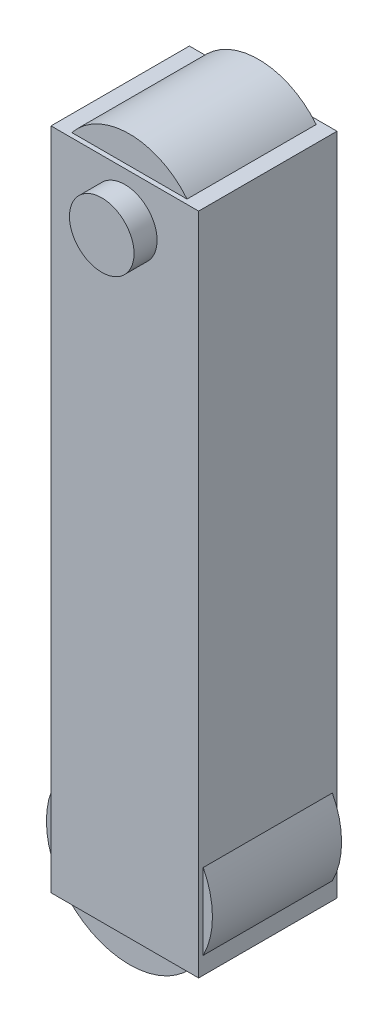
ISO-10303-21;
HEADER;
FILE_DESCRIPTION(('STEP AP214'),'2;1');
FILE_NAME('part.step','',(''),(''),'','','');
FILE_SCHEMA(('AUTOMOTIVE_DESIGN { 1 0 10303 214 1 1 1 1 }'));
ENDSEC;
DATA;
#1=APPLICATION_CONTEXT('core data for automotive mechanical design processes');
#2=APPLICATION_PROTOCOL_DEFINITION('international standard','automotive_design',2000,#1);
#3=PRODUCT_CONTEXT('',#1,'mechanical');
#4=PRODUCT('Part','Part','',(#3));
#5=PRODUCT_RELATED_PRODUCT_CATEGORY('part','',(#4));
#6=PRODUCT_DEFINITION_FORMATION('','',#4);
#7=PRODUCT_DEFINITION_CONTEXT('part definition',#1,'design');
#8=PRODUCT_DEFINITION('design','',#6,#7);
#9=PRODUCT_DEFINITION_SHAPE('','',#8);
#10=(LENGTH_UNIT() NAMED_UNIT(*) SI_UNIT(.MILLI.,.METRE.));
#11=(NAMED_UNIT(*) PLANE_ANGLE_UNIT() SI_UNIT($,.RADIAN.));
#12=(NAMED_UNIT(*) SI_UNIT($,.STERADIAN.) SOLID_ANGLE_UNIT());
#13=UNCERTAINTY_MEASURE_WITH_UNIT(LENGTH_MEASURE(1.E-05),#10,'distance_accuracy_value','');
#14=(GEOMETRIC_REPRESENTATION_CONTEXT(3) GLOBAL_UNCERTAINTY_ASSIGNED_CONTEXT((#13)) GLOBAL_UNIT_ASSIGNED_CONTEXT((#10,
#11,#12)) REPRESENTATION_CONTEXT('',''));
#15=CARTESIAN_POINT('',(0.,0.,0.));
#16=DIRECTION('',(0.,0.,1.));
#17=DIRECTION('',(1.,0.,0.));
#18=AXIS2_PLACEMENT_3D('',#15,#16,#17);
#19=CARTESIAN_POINT('',(-16.,64.,15.));
#20=DIRECTION('',(1.,0.,0.));
#21=DIRECTION('',(0.,0.,-1.));
#22=AXIS2_PLACEMENT_3D('',#19,#20,#21);
#23=PLANE('',#22);
#24=DIRECTION('',(0.,0.,-1.));
#25=VECTOR('',#24,1.);
#26=CARTESIAN_POINT('',(-16.,84.2462112512353,14.));
#27=LINE('',#26,#25);
#28=CARTESIAN_POINT('',(-16.,84.2462112512353,14.));
#29=VERTEX_POINT('',#28);
#30=CARTESIAN_POINT('',(-16.,84.2462112512353,-14.));
#31=VERTEX_POINT('',#30);
#32=EDGE_CURVE('E193',#29,#31,#27,.T.);
#33=ORIENTED_EDGE('',*,*,#32,.F.);
#34=DIRECTION('',(0.,-1.,0.));
#35=VECTOR('',#34,1.);
#36=CARTESIAN_POINT('',(-16.,64.,14.));
#37=LINE('',#36,#35);
#38=CARTESIAN_POINT('',(-16.,67.7537887487647,14.));
#39=VERTEX_POINT('',#38);
#40=EDGE_CURVE('E184',#29,#39,#37,.T.);
#41=ORIENTED_EDGE('',*,*,#40,.T.);
#42=DIRECTION('',(0.,0.,-1.));
#43=VECTOR('',#42,1.);
#44=CARTESIAN_POINT('',(-16.,67.7537887487647,14.));
#45=LINE('',#44,#43);
#46=CARTESIAN_POINT('',(-16.,67.7537887487647,-14.));
#47=VERTEX_POINT('',#46);
#48=EDGE_CURVE('E200',#47,#39,#45,.F.);
#49=ORIENTED_EDGE('',*,*,#48,.F.);
#50=DIRECTION('',(0.,-1.,0.));
#51=VECTOR('',#50,1.);
#52=CARTESIAN_POINT('',(-16.,64.,-14.));
#53=LINE('',#52,#51);
#54=EDGE_CURVE('E180',#31,#47,#53,.T.);
#55=ORIENTED_EDGE('',*,*,#54,.F.);
#56=EDGE_LOOP('',(#33,#41,#49,#55));
#57=FACE_BOUND('',#56,.T.);
#58=DIRECTION('',(0.,-1.,0.));
#59=VECTOR('',#58,1.);
#60=CARTESIAN_POINT('',(-16.,64.,-15.));
#61=LINE('',#60,#59);
#62=CARTESIAN_POINT('',(-16.,208.,-15.));
#63=VERTEX_POINT('',#62);
#64=CARTESIAN_POINT('',(-16.,64.,-15.));
#65=VERTEX_POINT('',#64);
#66=EDGE_CURVE('E201',#63,#65,#61,.T.);
#67=ORIENTED_EDGE('',*,*,#66,.T.);
#68=DIRECTION('',(0.,0.,-1.));
#69=VECTOR('',#68,1.);
#70=CARTESIAN_POINT('',(-16.,64.,15.));
#71=LINE('',#70,#69);
#72=CARTESIAN_POINT('',(-16.,64.,15.));
#73=VERTEX_POINT('',#72);
#74=EDGE_CURVE('E244',#73,#65,#71,.T.);
#75=ORIENTED_EDGE('',*,*,#74,.F.);
#76=DIRECTION('',(0.,-1.,0.));
#77=VECTOR('',#76,1.);
#78=CARTESIAN_POINT('',(-16.,64.,15.));
#79=LINE('',#78,#77);
#80=CARTESIAN_POINT('',(-16.,208.,15.));
#81=VERTEX_POINT('',#80);
#82=EDGE_CURVE('E204',#81,#73,#79,.T.);
#83=ORIENTED_EDGE('',*,*,#82,.F.);
#84=DIRECTION('',(0.,0.,-1.));
#85=VECTOR('',#84,1.);
#86=CARTESIAN_POINT('',(-16.,208.,15.));
#87=LINE('',#86,#85);
#88=EDGE_CURVE('E217',#81,#63,#87,.T.);
#89=ORIENTED_EDGE('',*,*,#88,.T.);
#90=EDGE_LOOP('',(#67,#75,#83,#89));
#91=FACE_BOUND('',#90,.T.);
#92=ADVANCED_FACE('F44',(#57,#91),#23,.F.);
#93=CARTESIAN_POINT('',(-16.,64.,15.));
#94=DIRECTION('',(0.,1.,0.));
#95=DIRECTION('',(0.,0.,1.));
#96=AXIS2_PLACEMENT_3D('',#93,#94,#95);
#97=PLANE('',#96);
#98=DIRECTION('',(0.,0.,-1.));
#99=VECTOR('',#98,1.);
#100=CARTESIAN_POINT('',(-13.4164078649987,64.,14.));
#101=LINE('',#100,#99);
#102=CARTESIAN_POINT('',(-13.4164078649987,64.,14.));
#103=VERTEX_POINT('',#102);
#104=CARTESIAN_POINT('',(-13.4164078649987,64.,-14.));
#105=VERTEX_POINT('',#104);
#106=EDGE_CURVE('E186',#103,#105,#101,.T.);
#107=ORIENTED_EDGE('',*,*,#106,.F.);
#108=DIRECTION('',(1.,0.,0.));
#109=VECTOR('',#108,1.);
#110=CARTESIAN_POINT('',(-16.,64.,14.));
#111=LINE('',#110,#109);
#112=CARTESIAN_POINT('',(13.4164078649987,64.,14.));
#113=VERTEX_POINT('',#112);
#114=EDGE_CURVE('E182',#103,#113,#111,.T.);
#115=ORIENTED_EDGE('',*,*,#114,.T.);
#116=DIRECTION('',(0.,0.,-1.));
#117=VECTOR('',#116,1.);
#118=CARTESIAN_POINT('',(13.4164078649987,64.,14.));
#119=LINE('',#118,#117);
#120=CARTESIAN_POINT('',(13.4164078649987,64.,-14.));
#121=VERTEX_POINT('',#120);
#122=EDGE_CURVE('E192',#121,#113,#119,.F.);
#123=ORIENTED_EDGE('',*,*,#122,.F.);
#124=DIRECTION('',(1.,0.,0.));
#125=VECTOR('',#124,1.);
#126=CARTESIAN_POINT('',(-16.,64.,-14.));
#127=LINE('',#126,#125);
#128=EDGE_CURVE('E175',#105,#121,#127,.T.);
#129=ORIENTED_EDGE('',*,*,#128,.F.);
#130=EDGE_LOOP('',(#107,#115,#123,#129));
#131=FACE_BOUND('',#130,.T.);
#132=DIRECTION('',(1.,0.,0.));
#133=VECTOR('',#132,1.);
#134=CARTESIAN_POINT('',(-16.,64.,-15.));
#135=LINE('',#134,#133);
#136=CARTESIAN_POINT('',(16.,64.,-15.));
#137=VERTEX_POINT('',#136);
#138=EDGE_CURVE('E225',#65,#137,#135,.T.);
#139=ORIENTED_EDGE('',*,*,#138,.T.);
#140=DIRECTION('',(0.,0.,-1.));
#141=VECTOR('',#140,1.);
#142=CARTESIAN_POINT('',(16.,64.,15.));
#143=LINE('',#142,#141);
#144=CARTESIAN_POINT('',(16.,64.,15.));
#145=VERTEX_POINT('',#144);
#146=EDGE_CURVE('E240',#145,#137,#143,.T.);
#147=ORIENTED_EDGE('',*,*,#146,.F.);
#148=DIRECTION('',(1.,0.,0.));
#149=VECTOR('',#148,1.);
#150=CARTESIAN_POINT('',(-16.,64.,15.));
#151=LINE('',#150,#149);
#152=EDGE_CURVE('E208',#73,#145,#151,.T.);
#153=ORIENTED_EDGE('',*,*,#152,.F.);
#154=ORIENTED_EDGE('',*,*,#74,.T.);
#155=EDGE_LOOP('',(#139,#147,#153,#154));
#156=FACE_BOUND('',#155,.T.);
#157=ADVANCED_FACE('F311',(#131,#156),#97,.F.);
#158=CARTESIAN_POINT('',(16.,64.,15.));
#159=DIRECTION('',(-1.,0.,0.));
#160=DIRECTION('',(0.,0.,1.));
#161=AXIS2_PLACEMENT_3D('',#158,#159,#160);
#162=PLANE('',#161);
#163=DIRECTION('',(0.,0.,-1.));
#164=VECTOR('',#163,1.);
#165=CARTESIAN_POINT('',(16.,67.7537887487647,14.));
#166=LINE('',#165,#164);
#167=CARTESIAN_POINT('',(16.,67.7537887487647,14.));
#168=VERTEX_POINT('',#167);
#169=CARTESIAN_POINT('',(16.,67.7537887487647,-14.));
#170=VERTEX_POINT('',#169);
#171=EDGE_CURVE('E246',#168,#170,#166,.T.);
#172=ORIENTED_EDGE('',*,*,#171,.F.);
#173=DIRECTION('',(0.,1.,0.));
#174=VECTOR('',#173,1.);
#175=CARTESIAN_POINT('',(16.,64.,14.));
#176=LINE('',#175,#174);
#177=CARTESIAN_POINT('',(16.,84.2462112512353,14.));
#178=VERTEX_POINT('',#177);
#179=EDGE_CURVE('E148',#168,#178,#176,.T.);
#180=ORIENTED_EDGE('',*,*,#179,.T.);
#181=DIRECTION('',(0.,0.,-1.));
#182=VECTOR('',#181,1.);
#183=CARTESIAN_POINT('',(16.,84.2462112512353,14.));
#184=LINE('',#183,#182);
#185=CARTESIAN_POINT('',(16.,84.2462112512353,-14.));
#186=VERTEX_POINT('',#185);
#187=EDGE_CURVE('E251',#186,#178,#184,.F.);
#188=ORIENTED_EDGE('',*,*,#187,.F.);
#189=DIRECTION('',(0.,1.,0.));
#190=VECTOR('',#189,1.);
#191=CARTESIAN_POINT('',(16.,64.,-14.));
#192=LINE('',#191,#190);
#193=EDGE_CURVE('E242',#170,#186,#192,.T.);
#194=ORIENTED_EDGE('',*,*,#193,.F.);
#195=EDGE_LOOP('',(#172,#180,#188,#194));
#196=FACE_BOUND('',#195,.T.);
#197=DIRECTION('',(0.,1.,0.));
#198=VECTOR('',#197,1.);
#199=CARTESIAN_POINT('',(16.,64.,-15.));
#200=LINE('',#199,#198);
#201=CARTESIAN_POINT('',(16.,208.,-15.));
#202=VERTEX_POINT('',#201);
#203=EDGE_CURVE('E223',#137,#202,#200,.T.);
#204=ORIENTED_EDGE('',*,*,#203,.T.);
#205=DIRECTION('',(0.,0.,-1.));
#206=VECTOR('',#205,1.);
#207=CARTESIAN_POINT('',(16.,208.,15.));
#208=LINE('',#207,#206);
#209=CARTESIAN_POINT('',(16.,208.,15.));
#210=VERTEX_POINT('',#209);
#211=EDGE_CURVE('E234',#210,#202,#208,.T.);
#212=ORIENTED_EDGE('',*,*,#211,.F.);
#213=DIRECTION('',(0.,1.,0.));
#214=VECTOR('',#213,1.);
#215=CARTESIAN_POINT('',(16.,64.,15.));
#216=LINE('',#215,#214);
#217=EDGE_CURVE('E215',#145,#210,#216,.T.);
#218=ORIENTED_EDGE('',*,*,#217,.F.);
#219=ORIENTED_EDGE('',*,*,#146,.T.);
#220=EDGE_LOOP('',(#204,#212,#218,#219));
#221=FACE_BOUND('',#220,.T.);
#222=ADVANCED_FACE('F319',(#196,#221),#162,.F.);
#223=CARTESIAN_POINT('',(-16.,208.,15.));
#224=DIRECTION('',(0.,-1.,0.));
#225=DIRECTION('',(0.,0.,-1.));
#226=AXIS2_PLACEMENT_3D('',#223,#224,#225);
#227=PLANE('',#226);
#228=DIRECTION('',(0.,0.,-1.));
#229=VECTOR('',#228,1.);
#230=CARTESIAN_POINT('',(12.4899959967968,208.,14.));
#231=LINE('',#230,#229);
#232=CARTESIAN_POINT('',(12.4899959967968,208.,14.));
#233=VERTEX_POINT('',#232);
#234=CARTESIAN_POINT('',(12.4899959967968,208.,-14.));
#235=VERTEX_POINT('',#234);
#236=EDGE_CURVE('E67',#233,#235,#231,.T.);
#237=ORIENTED_EDGE('',*,*,#236,.F.);
#238=DIRECTION('',(-1.,0.,0.));
#239=VECTOR('',#238,1.);
#240=CARTESIAN_POINT('',(-16.,208.,14.));
#241=LINE('',#240,#239);
#242=CARTESIAN_POINT('',(-12.4899959967968,208.,14.));
#243=VERTEX_POINT('',#242);
#244=EDGE_CURVE('E53',#233,#243,#241,.T.);
#245=ORIENTED_EDGE('',*,*,#244,.T.);
#246=DIRECTION('',(0.,0.,-1.));
#247=VECTOR('',#246,1.);
#248=CARTESIAN_POINT('',(-12.4899959967968,208.,14.));
#249=LINE('',#248,#247);
#250=CARTESIAN_POINT('',(-12.4899959967968,208.,-14.));
#251=VERTEX_POINT('',#250);
#252=EDGE_CURVE('E128',#251,#243,#249,.F.);
#253=ORIENTED_EDGE('',*,*,#252,.F.);
#254=DIRECTION('',(-1.,0.,0.));
#255=VECTOR('',#254,1.);
#256=CARTESIAN_POINT('',(-16.,208.,-14.));
#257=LINE('',#256,#255);
#258=EDGE_CURVE('E133',#235,#251,#257,.T.);
#259=ORIENTED_EDGE('',*,*,#258,.F.);
#260=EDGE_LOOP('',(#237,#245,#253,#259));
#261=FACE_BOUND('',#260,.T.);
#262=DIRECTION('',(-1.,0.,0.));
#263=VECTOR('',#262,1.);
#264=CARTESIAN_POINT('',(-16.,208.,-15.));
#265=LINE('',#264,#263);
#266=EDGE_CURVE('E207',#202,#63,#265,.T.);
#267=ORIENTED_EDGE('',*,*,#266,.T.);
#268=ORIENTED_EDGE('',*,*,#88,.F.);
#269=DIRECTION('',(-1.,0.,0.));
#270=VECTOR('',#269,1.);
#271=CARTESIAN_POINT('',(-16.,208.,15.));
#272=LINE('',#271,#270);
#273=EDGE_CURVE('E214',#210,#81,#272,.T.);
#274=ORIENTED_EDGE('',*,*,#273,.F.);
#275=ORIENTED_EDGE('',*,*,#211,.T.);
#276=EDGE_LOOP('',(#267,#268,#274,#275));
#277=FACE_BOUND('',#276,.T.);
#278=ADVANCED_FACE('F131',(#261,#277),#227,.F.);
#279=CARTESIAN_POINT('',(0.,0.,15.));
#280=DIRECTION('',(0.,0.,-1.));
#281=DIRECTION('',(-1.,0.,0.));
#282=AXIS2_PLACEMENT_3D('',#279,#280,#281);
#283=PLANE('',#282);
#284=CARTESIAN_POINT('',(0.,198.,15.));
#285=DIRECTION('',(0.,0.,-1.));
#286=DIRECTION('',(-1.,0.,0.));
#287=AXIS2_PLACEMENT_3D('',#284,#285,#286);
#288=CIRCLE('',#287,7.);
#289=CARTESIAN_POINT('',(-7.,198.,15.));
#290=VERTEX_POINT('',#289);
#291=EDGE_CURVE('E11',#290,#290,#288,.F.);
#292=ORIENTED_EDGE('',*,*,#291,.F.);
#293=EDGE_LOOP('',(#292));
#294=FACE_BOUND('',#293,.T.);
#295=ORIENTED_EDGE('',*,*,#82,.T.);
#296=ORIENTED_EDGE('',*,*,#152,.T.);
#297=ORIENTED_EDGE('',*,*,#217,.T.);
#298=ORIENTED_EDGE('',*,*,#273,.T.);
#299=EDGE_LOOP('',(#295,#296,#297,#298));
#300=FACE_BOUND('',#299,.T.);
#301=ADVANCED_FACE('F339',(#294,#300),#283,.F.);
#302=CARTESIAN_POINT('',(0.,0.,-15.));
#303=DIRECTION('',(0.,0.,-1.));
#304=DIRECTION('',(-1.,0.,0.));
#305=AXIS2_PLACEMENT_3D('',#302,#303,#304);
#306=PLANE('',#305);
#307=CARTESIAN_POINT('',(0.,118.,-15.));
#308=DIRECTION('',(0.,0.,-1.));
#309=DIRECTION('',(-1.,0.,0.));
#310=AXIS2_PLACEMENT_3D('',#307,#308,#309);
#311=CIRCLE('',#310,10.);
#312=CARTESIAN_POINT('',(-10.,118.,-15.));
#313=VERTEX_POINT('',#312);
#314=EDGE_CURVE('E48',#313,#313,#311,.T.);
#315=ORIENTED_EDGE('',*,*,#314,.F.);
#316=EDGE_LOOP('',(#315));
#317=FACE_BOUND('',#316,.T.);
#318=CARTESIAN_POINT('',(0.,155.,-15.));
#319=DIRECTION('',(0.,0.,-1.));
#320=DIRECTION('',(-1.,0.,0.));
#321=AXIS2_PLACEMENT_3D('',#318,#319,#320);
#322=CIRCLE('',#321,10.);
#323=CARTESIAN_POINT('',(-10.,155.,-15.));
#324=VERTEX_POINT('',#323);
#325=EDGE_CURVE('E270',#324,#324,#322,.T.);
#326=ORIENTED_EDGE('',*,*,#325,.F.);
#327=EDGE_LOOP('',(#326));
#328=FACE_BOUND('',#327,.T.);
#329=CARTESIAN_POINT('',(0.,198.,-15.));
#330=DIRECTION('',(0.,0.,-1.));
#331=DIRECTION('',(-1.,0.,0.));
#332=AXIS2_PLACEMENT_3D('',#329,#330,#331);
#333=CIRCLE('',#332,7.);
#334=CARTESIAN_POINT('',(-7.,198.,-15.));
#335=VERTEX_POINT('',#334);
#336=EDGE_CURVE('E263',#335,#335,#333,.F.);
#337=ORIENTED_EDGE('',*,*,#336,.T.);
#338=EDGE_LOOP('',(#337));
#339=FACE_BOUND('',#338,.T.);
#340=CARTESIAN_POINT('',(0.,76.,-15.));
#341=DIRECTION('',(0.,0.,1.));
#342=DIRECTION('',(1.,0.,0.));
#343=AXIS2_PLACEMENT_3D('',#340,#341,#342);
#344=CIRCLE('',#343,8.25);
#345=CARTESIAN_POINT('',(8.25,76.,-15.));
#346=VERTEX_POINT('',#345);
#347=EDGE_CURVE('E151',#346,#346,#344,.T.);
#348=ORIENTED_EDGE('',*,*,#347,.T.);
#349=EDGE_LOOP('',(#348));
#350=FACE_BOUND('',#349,.T.);
#351=ORIENTED_EDGE('',*,*,#66,.F.);
#352=ORIENTED_EDGE('',*,*,#266,.F.);
#353=ORIENTED_EDGE('',*,*,#203,.F.);
#354=ORIENTED_EDGE('',*,*,#138,.F.);
#355=EDGE_LOOP('',(#351,#352,#353,#354));
#356=FACE_BOUND('',#355,.T.);
#357=ADVANCED_FACE('F329',(#317,#328,#339,#350,#356),#306,.T.);
#358=CARTESIAN_POINT('',(0.,76.,14.));
#359=DIRECTION('',(0.,0.,1.));
#360=DIRECTION('',(1.,0.,0.));
#361=AXIS2_PLACEMENT_3D('',#358,#359,#360);
#362=PLANE('',#361);
#363=ORIENTED_EDGE('',*,*,#179,.F.);
#364=CARTESIAN_POINT('',(0.,76.,14.));
#365=DIRECTION('',(0.,0.,1.));
#366=DIRECTION('',(1.,0.,0.));
#367=AXIS2_PLACEMENT_3D('',#364,#365,#366);
#368=CIRCLE('',#367,18.);
#369=EDGE_CURVE('E165',#168,#178,#368,.T.);
#370=ORIENTED_EDGE('',*,*,#369,.T.);
#371=EDGE_LOOP('',(#363,#370));
#372=FACE_BOUND('',#371,.T.);
#373=ADVANCED_FACE('F349',(#372),#362,.T.);
#374=CARTESIAN_POINT('',(0.,76.,-14.));
#375=DIRECTION('',(0.,0.,1.));
#376=DIRECTION('',(1.,0.,0.));
#377=AXIS2_PLACEMENT_3D('',#374,#375,#376);
#378=PLANE('',#377);
#379=CARTESIAN_POINT('',(0.,76.,-14.));
#380=DIRECTION('',(0.,0.,1.));
#381=DIRECTION('',(1.,0.,0.));
#382=AXIS2_PLACEMENT_3D('',#379,#380,#381);
#383=CIRCLE('',#382,18.);
#384=EDGE_CURVE('E154',#170,#186,#383,.T.);
#385=ORIENTED_EDGE('',*,*,#384,.F.);
#386=ORIENTED_EDGE('',*,*,#193,.T.);
#387=EDGE_LOOP('',(#385,#386));
#388=FACE_BOUND('',#387,.T.);
#389=ADVANCED_FACE('F365',(#388),#378,.F.);
#390=CARTESIAN_POINT('',(0.,76.,14.));
#391=DIRECTION('',(0.,0.,-1.));
#392=DIRECTION('',(-1.,0.,0.));
#393=AXIS2_PLACEMENT_3D('',#390,#391,#392);
#394=CYLINDRICAL_SURFACE('',#393,18.);
#395=ORIENTED_EDGE('',*,*,#384,.T.);
#396=ORIENTED_EDGE('',*,*,#187,.T.);
#397=ORIENTED_EDGE('',*,*,#369,.F.);
#398=ORIENTED_EDGE('',*,*,#171,.T.);
#399=EDGE_LOOP('',(#395,#396,#397,#398));
#400=FACE_BOUND('',#399,.T.);
#401=ADVANCED_FACE('F356',(#400),#394,.T.);
#402=ORIENTED_EDGE('',*,*,#114,.F.);
#403=EDGE_CURVE('E167',#103,#113,#368,.T.);
#404=ORIENTED_EDGE('',*,*,#403,.T.);
#405=EDGE_LOOP('',(#402,#404));
#406=FACE_BOUND('',#405,.T.);
#407=ADVANCED_FACE('F366',(#406),#362,.T.);
#408=EDGE_CURVE('E171',#105,#121,#383,.T.);
#409=ORIENTED_EDGE('',*,*,#408,.F.);
#410=ORIENTED_EDGE('',*,*,#128,.T.);
#411=EDGE_LOOP('',(#409,#410));
#412=FACE_BOUND('',#411,.T.);
#413=ADVANCED_FACE('F361',(#412),#378,.F.);
#414=ORIENTED_EDGE('',*,*,#408,.T.);
#415=ORIENTED_EDGE('',*,*,#122,.T.);
#416=ORIENTED_EDGE('',*,*,#403,.F.);
#417=ORIENTED_EDGE('',*,*,#106,.T.);
#418=EDGE_LOOP('',(#414,#415,#416,#417));
#419=FACE_BOUND('',#418,.T.);
#420=ADVANCED_FACE('F360',(#419),#394,.T.);
#421=EDGE_CURVE('E170',#31,#47,#383,.T.);
#422=ORIENTED_EDGE('',*,*,#421,.T.);
#423=ORIENTED_EDGE('',*,*,#48,.T.);
#424=EDGE_CURVE('E169',#29,#39,#368,.T.);
#425=ORIENTED_EDGE('',*,*,#424,.F.);
#426=ORIENTED_EDGE('',*,*,#32,.T.);
#427=EDGE_LOOP('',(#422,#423,#425,#426));
#428=FACE_BOUND('',#427,.T.);
#429=ADVANCED_FACE('F355',(#428),#394,.T.);
#430=ORIENTED_EDGE('',*,*,#40,.F.);
#431=ORIENTED_EDGE('',*,*,#424,.T.);
#432=EDGE_LOOP('',(#430,#431));
#433=FACE_BOUND('',#432,.T.);
#434=ADVANCED_FACE('F357',(#433),#362,.T.);
#435=ORIENTED_EDGE('',*,*,#421,.F.);
#436=ORIENTED_EDGE('',*,*,#54,.T.);
#437=EDGE_LOOP('',(#435,#436));
#438=FACE_BOUND('',#437,.T.);
#439=ADVANCED_FACE('F358',(#438),#378,.F.);
#440=CARTESIAN_POINT('',(0.,198.,14.));
#441=DIRECTION('',(0.,0.,-1.));
#442=DIRECTION('',(-1.,0.,0.));
#443=AXIS2_PLACEMENT_3D('',#440,#441,#442);
#444=CYLINDRICAL_SURFACE('',#443,16.);
#445=CARTESIAN_POINT('',(0.,198.,-14.));
#446=DIRECTION('',(0.,0.,1.));
#447=DIRECTION('',(1.,0.,0.));
#448=AXIS2_PLACEMENT_3D('',#445,#446,#447);
#449=CIRCLE('',#448,16.);
#450=EDGE_CURVE('E145',#235,#251,#449,.T.);
#451=ORIENTED_EDGE('',*,*,#450,.T.);
#452=ORIENTED_EDGE('',*,*,#252,.T.);
#453=CARTESIAN_POINT('',(0.,198.,14.));
#454=DIRECTION('',(0.,0.,1.));
#455=DIRECTION('',(1.,0.,0.));
#456=AXIS2_PLACEMENT_3D('',#453,#454,#455);
#457=CIRCLE('',#456,16.);
#458=EDGE_CURVE('E147',#233,#243,#457,.T.);
#459=ORIENTED_EDGE('',*,*,#458,.F.);
#460=ORIENTED_EDGE('',*,*,#236,.T.);
#461=EDGE_LOOP('',(#451,#452,#459,#460));
#462=FACE_BOUND('',#461,.T.);
#463=ADVANCED_FACE('F146',(#462),#444,.T.);
#464=CARTESIAN_POINT('',(0.,198.,14.));
#465=DIRECTION('',(0.,0.,1.));
#466=DIRECTION('',(1.,0.,0.));
#467=AXIS2_PLACEMENT_3D('',#464,#465,#466);
#468=PLANE('',#467);
#469=ORIENTED_EDGE('',*,*,#244,.F.);
#470=ORIENTED_EDGE('',*,*,#458,.T.);
#471=EDGE_LOOP('',(#469,#470));
#472=FACE_BOUND('',#471,.T.);
#473=ADVANCED_FACE('F371',(#472),#468,.T.);
#474=CARTESIAN_POINT('',(0.,198.,-14.));
#475=DIRECTION('',(0.,0.,1.));
#476=DIRECTION('',(1.,0.,0.));
#477=AXIS2_PLACEMENT_3D('',#474,#475,#476);
#478=PLANE('',#477);
#479=ORIENTED_EDGE('',*,*,#450,.F.);
#480=ORIENTED_EDGE('',*,*,#258,.T.);
#481=EDGE_LOOP('',(#479,#480));
#482=FACE_BOUND('',#481,.T.);
#483=ADVANCED_FACE('F141',(#482),#478,.F.);
#484=CARTESIAN_POINT('',(0.,76.,-15.));
#485=DIRECTION('',(0.,0.,1.));
#486=DIRECTION('',(1.,0.,0.));
#487=AXIS2_PLACEMENT_3D('',#484,#485,#486);
#488=CYLINDRICAL_SURFACE('',#487,8.25);
#489=ORIENTED_EDGE('',*,*,#347,.F.);
#490=EDGE_LOOP('',(#489));
#491=FACE_BOUND('',#490,.T.);
#492=CARTESIAN_POINT('',(0.,76.,0.));
#493=DIRECTION('',(0.,0.,1.));
#494=DIRECTION('',(1.,0.,0.));
#495=AXIS2_PLACEMENT_3D('',#492,#493,#494);
#496=CIRCLE('',#495,8.25);
#497=CARTESIAN_POINT('',(8.25,76.,0.));
#498=VERTEX_POINT('',#497);
#499=EDGE_CURVE('E158',#498,#498,#496,.T.);
#500=ORIENTED_EDGE('',*,*,#499,.T.);
#501=EDGE_LOOP('',(#500));
#502=FACE_BOUND('',#501,.T.);
#503=ADVANCED_FACE('F293',(#491,#502),#488,.F.);
#504=CARTESIAN_POINT('',(0.,76.,0.));
#505=DIRECTION('',(0.,0.,1.));
#506=DIRECTION('',(1.,0.,0.));
#507=AXIS2_PLACEMENT_3D('',#504,#505,#506);
#508=PLANE('',#507);
#509=ORIENTED_EDGE('',*,*,#499,.F.);
#510=EDGE_LOOP('',(#509));
#511=FACE_BOUND('',#510,.T.);
#512=ADVANCED_FACE('F296',(#511),#508,.F.);
#513=CARTESIAN_POINT('',(0.,198.,-20.));
#514=DIRECTION('',(0.,0.,1.));
#515=DIRECTION('',(1.,0.,0.));
#516=AXIS2_PLACEMENT_3D('',#513,#514,#515);
#517=PLANE('',#516);
#518=CARTESIAN_POINT('',(0.,198.,-20.));
#519=DIRECTION('',(0.,0.,1.));
#520=DIRECTION('',(1.,0.,0.));
#521=AXIS2_PLACEMENT_3D('',#518,#519,#520);
#522=CIRCLE('',#521,7.);
#523=CARTESIAN_POINT('',(7.,198.,-20.));
#524=VERTEX_POINT('',#523);
#525=EDGE_CURVE('E277',#524,#524,#522,.T.);
#526=ORIENTED_EDGE('',*,*,#525,.F.);
#527=EDGE_LOOP('',(#526));
#528=FACE_BOUND('',#527,.T.);
#529=ADVANCED_FACE('F298',(#528),#517,.F.);
#530=CARTESIAN_POINT('',(0.,198.,20.));
#531=DIRECTION('',(0.,0.,-1.));
#532=DIRECTION('',(-1.,0.,0.));
#533=AXIS2_PLACEMENT_3D('',#530,#531,#532);
#534=CYLINDRICAL_SURFACE('',#533,7.);
#535=ORIENTED_EDGE('',*,*,#336,.F.);
#536=EDGE_LOOP('',(#535));
#537=FACE_BOUND('',#536,.T.);
#538=ORIENTED_EDGE('',*,*,#525,.T.);
#539=EDGE_LOOP('',(#538));
#540=FACE_BOUND('',#539,.T.);
#541=ADVANCED_FACE('F308',(#537,#540),#534,.T.);
#542=CARTESIAN_POINT('',(0.,198.,20.));
#543=DIRECTION('',(0.,0.,1.));
#544=DIRECTION('',(1.,0.,0.));
#545=AXIS2_PLACEMENT_3D('',#542,#543,#544);
#546=CIRCLE('',#545,7.);
#547=CARTESIAN_POINT('',(7.,198.,20.));
#548=VERTEX_POINT('',#547);
#549=EDGE_CURVE('E266',#548,#548,#546,.T.);
#550=ORIENTED_EDGE('',*,*,#549,.F.);
#551=EDGE_LOOP('',(#550));
#552=FACE_BOUND('',#551,.T.);
#553=ORIENTED_EDGE('',*,*,#291,.T.);
#554=EDGE_LOOP('',(#553));
#555=FACE_BOUND('',#554,.T.);
#556=ADVANCED_FACE('F407',(#552,#555),#534,.T.);
#557=CARTESIAN_POINT('',(0.,198.,20.));
#558=DIRECTION('',(0.,0.,1.));
#559=DIRECTION('',(1.,0.,0.));
#560=AXIS2_PLACEMENT_3D('',#557,#558,#559);
#561=PLANE('',#560);
#562=ORIENTED_EDGE('',*,*,#549,.T.);
#563=EDGE_LOOP('',(#562));
#564=FACE_BOUND('',#563,.T.);
#565=ADVANCED_FACE('F420',(#564),#561,.T.);
#566=CARTESIAN_POINT('',(0.,155.,-20.));
#567=DIRECTION('',(0.,0.,1.));
#568=DIRECTION('',(1.,0.,0.));
#569=AXIS2_PLACEMENT_3D('',#566,#567,#568);
#570=CYLINDRICAL_SURFACE('',#569,10.);
#571=ORIENTED_EDGE('',*,*,#325,.T.);
#572=EDGE_LOOP('',(#571));
#573=FACE_BOUND('',#572,.T.);
#574=CARTESIAN_POINT('',(0.,155.,0.));
#575=DIRECTION('',(0.,0.,1.));
#576=DIRECTION('',(1.,0.,0.));
#577=AXIS2_PLACEMENT_3D('',#574,#575,#576);
#578=CIRCLE('',#577,10.);
#579=CARTESIAN_POINT('',(10.,155.,0.));
#580=VERTEX_POINT('',#579);
#581=EDGE_CURVE('E279',#580,#580,#578,.T.);
#582=ORIENTED_EDGE('',*,*,#581,.T.);
#583=EDGE_LOOP('',(#582));
#584=FACE_BOUND('',#583,.T.);
#585=ADVANCED_FACE('F428',(#573,#584),#570,.F.);
#586=CARTESIAN_POINT('',(0.,155.,0.));
#587=DIRECTION('',(0.,0.,1.));
#588=DIRECTION('',(1.,0.,0.));
#589=AXIS2_PLACEMENT_3D('',#586,#587,#588);
#590=PLANE('',#589);
#591=ORIENTED_EDGE('',*,*,#581,.F.);
#592=EDGE_LOOP('',(#591));
#593=FACE_BOUND('',#592,.T.);
#594=ADVANCED_FACE('F437',(#593),#590,.F.);
#595=CARTESIAN_POINT('',(0.,118.,-20.));
#596=DIRECTION('',(0.,0.,1.));
#597=DIRECTION('',(1.,0.,0.));
#598=AXIS2_PLACEMENT_3D('',#595,#596,#597);
#599=CYLINDRICAL_SURFACE('',#598,10.);
#600=ORIENTED_EDGE('',*,*,#314,.T.);
#601=EDGE_LOOP('',(#600));
#602=FACE_BOUND('',#601,.T.);
#603=CARTESIAN_POINT('',(0.,118.,0.));
#604=DIRECTION('',(0.,0.,1.));
#605=DIRECTION('',(1.,0.,0.));
#606=AXIS2_PLACEMENT_3D('',#603,#604,#605);
#607=CIRCLE('',#606,10.);
#608=CARTESIAN_POINT('',(10.,118.,0.));
#609=VERTEX_POINT('',#608);
#610=EDGE_CURVE('E269',#609,#609,#607,.T.);
#611=ORIENTED_EDGE('',*,*,#610,.T.);
#612=EDGE_LOOP('',(#611));
#613=FACE_BOUND('',#612,.T.);
#614=ADVANCED_FACE('F446',(#602,#613),#599,.F.);
#615=CARTESIAN_POINT('',(0.,118.,0.));
#616=DIRECTION('',(0.,0.,1.));
#617=DIRECTION('',(1.,0.,0.));
#618=AXIS2_PLACEMENT_3D('',#615,#616,#617);
#619=PLANE('',#618);
#620=ORIENTED_EDGE('',*,*,#610,.F.);
#621=EDGE_LOOP('',(#620));
#622=FACE_BOUND('',#621,.T.);
#623=ADVANCED_FACE('F460',(#622),#619,.F.);
#624=CLOSED_SHELL('',(#92,#157,#222,#278,#301,#357,#373,#389,#401,#407,#413,#420,#429,#434,#439,
#463,#473,#483,#503,#512,#529,#541,#556,#565,#585,#594,#614,#623));
#625=MANIFOLD_SOLID_BREP('B2',#624);
#626=ADVANCED_BREP_SHAPE_REPRESENTATION('',(#18,#625),#14);
#627=SHAPE_DEFINITION_REPRESENTATION(#9,#626);
ENDSEC;
END-ISO-10303-21;
